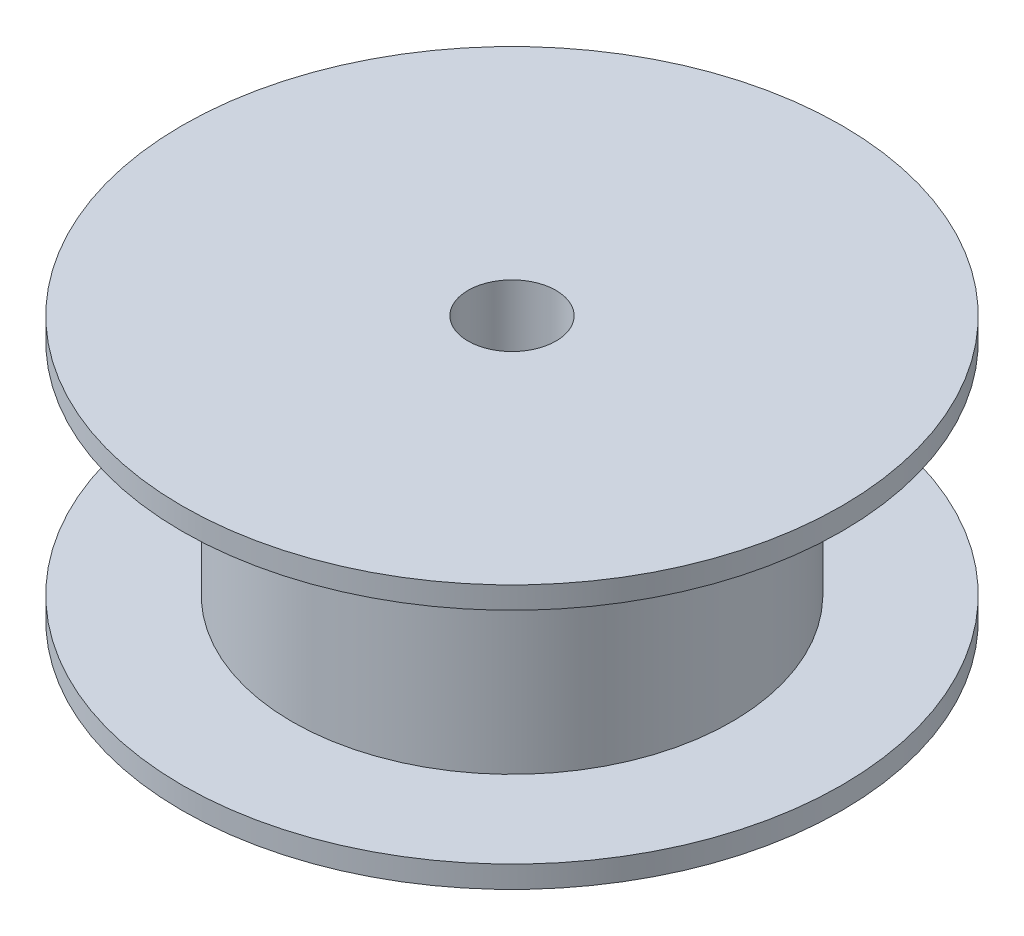
ISO-10303-21;
HEADER;
FILE_DESCRIPTION(('STEP AP214'),'2;1');
FILE_NAME('part.step','',(''),(''),'','','');
FILE_SCHEMA(('AUTOMOTIVE_DESIGN { 1 0 10303 214 1 1 1 1 }'));
ENDSEC;
DATA;
#1=APPLICATION_CONTEXT('core data for automotive mechanical design processes');
#2=APPLICATION_PROTOCOL_DEFINITION('international standard','automotive_design',2000,#1);
#3=PRODUCT_CONTEXT('',#1,'mechanical');
#4=PRODUCT('Part','Part','',(#3));
#5=PRODUCT_RELATED_PRODUCT_CATEGORY('part','',(#4));
#6=PRODUCT_DEFINITION_FORMATION('','',#4);
#7=PRODUCT_DEFINITION_CONTEXT('part definition',#1,'design');
#8=PRODUCT_DEFINITION('design','',#6,#7);
#9=PRODUCT_DEFINITION_SHAPE('','',#8);
#10=(LENGTH_UNIT() NAMED_UNIT(*) SI_UNIT(.MILLI.,.METRE.));
#11=(NAMED_UNIT(*) PLANE_ANGLE_UNIT() SI_UNIT($,.RADIAN.));
#12=(NAMED_UNIT(*) SI_UNIT($,.STERADIAN.) SOLID_ANGLE_UNIT());
#13=UNCERTAINTY_MEASURE_WITH_UNIT(LENGTH_MEASURE(1.E-05),#10,'distance_accuracy_value','');
#14=(GEOMETRIC_REPRESENTATION_CONTEXT(3) GLOBAL_UNCERTAINTY_ASSIGNED_CONTEXT((#13)) GLOBAL_UNIT_ASSIGNED_CONTEXT((#10,
#11,#12)) REPRESENTATION_CONTEXT('',''));
#15=CARTESIAN_POINT('',(0.,0.,0.));
#16=DIRECTION('',(0.,0.,1.));
#17=DIRECTION('',(1.,0.,0.));
#18=AXIS2_PLACEMENT_3D('',#15,#16,#17);
#19=CARTESIAN_POINT('',(0.,10.,0.));
#20=DIRECTION('',(0.,-1.,0.));
#21=DIRECTION('',(0.,0.,-1.));
#22=AXIS2_PLACEMENT_3D('',#19,#20,#21);
#23=CYLINDRICAL_SURFACE('',#22,10.);
#24=CARTESIAN_POINT('',(0.,10.,0.));
#25=DIRECTION('',(0.,1.,0.));
#26=DIRECTION('',(0.,0.,1.));
#27=AXIS2_PLACEMENT_3D('',#24,#25,#26);
#28=CIRCLE('',#27,10.);
#29=CARTESIAN_POINT('',(0.,10.,10.));
#30=VERTEX_POINT('',#29);
#31=EDGE_CURVE('E10',#30,#30,#28,.T.);
#32=ORIENTED_EDGE('',*,*,#31,.F.);
#33=EDGE_LOOP('',(#32));
#34=FACE_BOUND('',#33,.T.);
#35=CARTESIAN_POINT('',(0.,0.,0.));
#36=DIRECTION('',(0.,1.,0.));
#37=DIRECTION('',(0.,0.,1.));
#38=AXIS2_PLACEMENT_3D('',#35,#36,#37);
#39=CIRCLE('',#38,10.);
#40=CARTESIAN_POINT('',(0.,0.,10.));
#41=VERTEX_POINT('',#40);
#42=EDGE_CURVE('E34',#41,#41,#39,.T.);
#43=ORIENTED_EDGE('',*,*,#42,.T.);
#44=EDGE_LOOP('',(#43));
#45=FACE_BOUND('',#44,.T.);
#46=ADVANCED_FACE('F31',(#34,#45),#23,.T.);
#47=CARTESIAN_POINT('',(0.,10.,0.));
#48=DIRECTION('',(0.,-1.,0.));
#49=DIRECTION('',(0.,0.,-1.));
#50=AXIS2_PLACEMENT_3D('',#47,#48,#49);
#51=CYLINDRICAL_SURFACE('',#50,2.);
#52=CARTESIAN_POINT('',(0.,11.,0.));
#53=DIRECTION('',(0.,1.,0.));
#54=DIRECTION('',(0.,0.,1.));
#55=AXIS2_PLACEMENT_3D('',#52,#53,#54);
#56=CIRCLE('',#55,2.);
#57=CARTESIAN_POINT('',(0.,11.,2.));
#58=VERTEX_POINT('',#57);
#59=EDGE_CURVE('E46',#58,#58,#56,.T.);
#60=ORIENTED_EDGE('',*,*,#59,.T.);
#61=EDGE_LOOP('',(#60));
#62=FACE_BOUND('',#61,.T.);
#63=CARTESIAN_POINT('',(0.,-1.,0.));
#64=DIRECTION('',(0.,-1.,0.));
#65=DIRECTION('',(0.,0.,-1.));
#66=AXIS2_PLACEMENT_3D('',#63,#64,#65);
#67=CIRCLE('',#66,2.);
#68=CARTESIAN_POINT('',(0.,-1.,-2.));
#69=VERTEX_POINT('',#68);
#70=EDGE_CURVE('E54',#69,#69,#67,.T.);
#71=ORIENTED_EDGE('',*,*,#70,.T.);
#72=EDGE_LOOP('',(#71));
#73=FACE_BOUND('',#72,.T.);
#74=ADVANCED_FACE('F60',(#62,#73),#51,.F.);
#75=CARTESIAN_POINT('',(0.,11.,0.));
#76=DIRECTION('',(0.,1.,0.));
#77=DIRECTION('',(0.,0.,1.));
#78=AXIS2_PLACEMENT_3D('',#75,#76,#77);
#79=PLANE('',#78);
#80=CARTESIAN_POINT('',(0.,11.,0.));
#81=DIRECTION('',(0.,1.,0.));
#82=DIRECTION('',(0.,0.,1.));
#83=AXIS2_PLACEMENT_3D('',#80,#81,#82);
#84=CIRCLE('',#83,15.);
#85=CARTESIAN_POINT('',(0.,11.,15.));
#86=VERTEX_POINT('',#85);
#87=EDGE_CURVE('E38',#86,#86,#84,.T.);
#88=ORIENTED_EDGE('',*,*,#87,.T.);
#89=EDGE_LOOP('',(#88));
#90=FACE_BOUND('',#89,.T.);
#91=ORIENTED_EDGE('',*,*,#59,.F.);
#92=EDGE_LOOP('',(#91));
#93=FACE_BOUND('',#92,.T.);
#94=ADVANCED_FACE('F83',(#90,#93),#79,.T.);
#95=CARTESIAN_POINT('',(0.,10.,0.));
#96=DIRECTION('',(0.,1.,0.));
#97=DIRECTION('',(0.,0.,1.));
#98=AXIS2_PLACEMENT_3D('',#95,#96,#97);
#99=PLANE('',#98);
#100=ORIENTED_EDGE('',*,*,#31,.T.);
#101=EDGE_LOOP('',(#100));
#102=FACE_BOUND('',#101,.T.);
#103=CARTESIAN_POINT('',(0.,10.,0.));
#104=DIRECTION('',(0.,1.,0.));
#105=DIRECTION('',(0.,0.,1.));
#106=AXIS2_PLACEMENT_3D('',#103,#104,#105);
#107=CIRCLE('',#106,15.);
#108=CARTESIAN_POINT('',(0.,10.,15.));
#109=VERTEX_POINT('',#108);
#110=EDGE_CURVE('E42',#109,#109,#107,.T.);
#111=ORIENTED_EDGE('',*,*,#110,.F.);
#112=EDGE_LOOP('',(#111));
#113=FACE_BOUND('',#112,.T.);
#114=ADVANCED_FACE('F75',(#102,#113),#99,.F.);
#115=CARTESIAN_POINT('',(0.,11.,0.));
#116=DIRECTION('',(0.,-1.,0.));
#117=DIRECTION('',(0.,0.,-1.));
#118=AXIS2_PLACEMENT_3D('',#115,#116,#117);
#119=CYLINDRICAL_SURFACE('',#118,15.);
#120=ORIENTED_EDGE('',*,*,#87,.F.);
#121=EDGE_LOOP('',(#120));
#122=FACE_BOUND('',#121,.T.);
#123=ORIENTED_EDGE('',*,*,#110,.T.);
#124=EDGE_LOOP('',(#123));
#125=FACE_BOUND('',#124,.T.);
#126=ADVANCED_FACE('F65',(#122,#125),#119,.T.);
#127=CARTESIAN_POINT('',(0.,-1.,0.));
#128=DIRECTION('',(0.,-1.,0.));
#129=DIRECTION('',(0.,0.,-1.));
#130=AXIS2_PLACEMENT_3D('',#127,#128,#129);
#131=PLANE('',#130);
#132=CARTESIAN_POINT('',(0.,-1.,0.));
#133=DIRECTION('',(0.,-1.,0.));
#134=DIRECTION('',(0.,0.,-1.));
#135=AXIS2_PLACEMENT_3D('',#132,#133,#134);
#136=CIRCLE('',#135,15.);
#137=CARTESIAN_POINT('',(0.,-1.,-15.));
#138=VERTEX_POINT('',#137);
#139=EDGE_CURVE('E53',#138,#138,#136,.T.);
#140=ORIENTED_EDGE('',*,*,#139,.T.);
#141=EDGE_LOOP('',(#140));
#142=FACE_BOUND('',#141,.T.);
#143=ORIENTED_EDGE('',*,*,#70,.F.);
#144=EDGE_LOOP('',(#143));
#145=FACE_BOUND('',#144,.T.);
#146=ADVANCED_FACE('F62',(#142,#145),#131,.T.);
#147=CARTESIAN_POINT('',(0.,0.,0.));
#148=DIRECTION('',(0.,-1.,0.));
#149=DIRECTION('',(0.,0.,-1.));
#150=AXIS2_PLACEMENT_3D('',#147,#148,#149);
#151=PLANE('',#150);
#152=ORIENTED_EDGE('',*,*,#42,.F.);
#153=EDGE_LOOP('',(#152));
#154=FACE_BOUND('',#153,.T.);
#155=CARTESIAN_POINT('',(0.,0.,0.));
#156=DIRECTION('',(0.,-1.,0.));
#157=DIRECTION('',(0.,0.,-1.));
#158=AXIS2_PLACEMENT_3D('',#155,#156,#157);
#159=CIRCLE('',#158,15.);
#160=CARTESIAN_POINT('',(0.,0.,-15.));
#161=VERTEX_POINT('',#160);
#162=EDGE_CURVE('E50',#161,#161,#159,.T.);
#163=ORIENTED_EDGE('',*,*,#162,.F.);
#164=EDGE_LOOP('',(#163));
#165=FACE_BOUND('',#164,.T.);
#166=ADVANCED_FACE('F64',(#154,#165),#151,.F.);
#167=CARTESIAN_POINT('',(0.,-1.,0.));
#168=DIRECTION('',(0.,1.,0.));
#169=DIRECTION('',(0.,0.,1.));
#170=AXIS2_PLACEMENT_3D('',#167,#168,#169);
#171=CYLINDRICAL_SURFACE('',#170,15.);
#172=ORIENTED_EDGE('',*,*,#139,.F.);
#173=EDGE_LOOP('',(#172));
#174=FACE_BOUND('',#173,.T.);
#175=ORIENTED_EDGE('',*,*,#162,.T.);
#176=EDGE_LOOP('',(#175));
#177=FACE_BOUND('',#176,.T.);
#178=ADVANCED_FACE('F72',(#174,#177),#171,.T.);
#179=CLOSED_SHELL('',(#46,#74,#94,#114,#126,#146,#166,#178));
#180=MANIFOLD_SOLID_BREP('B2',#179);
#181=ADVANCED_BREP_SHAPE_REPRESENTATION('',(#18,#180),#14);
#182=SHAPE_DEFINITION_REPRESENTATION(#9,#181);
ENDSEC;
END-ISO-10303-21;
